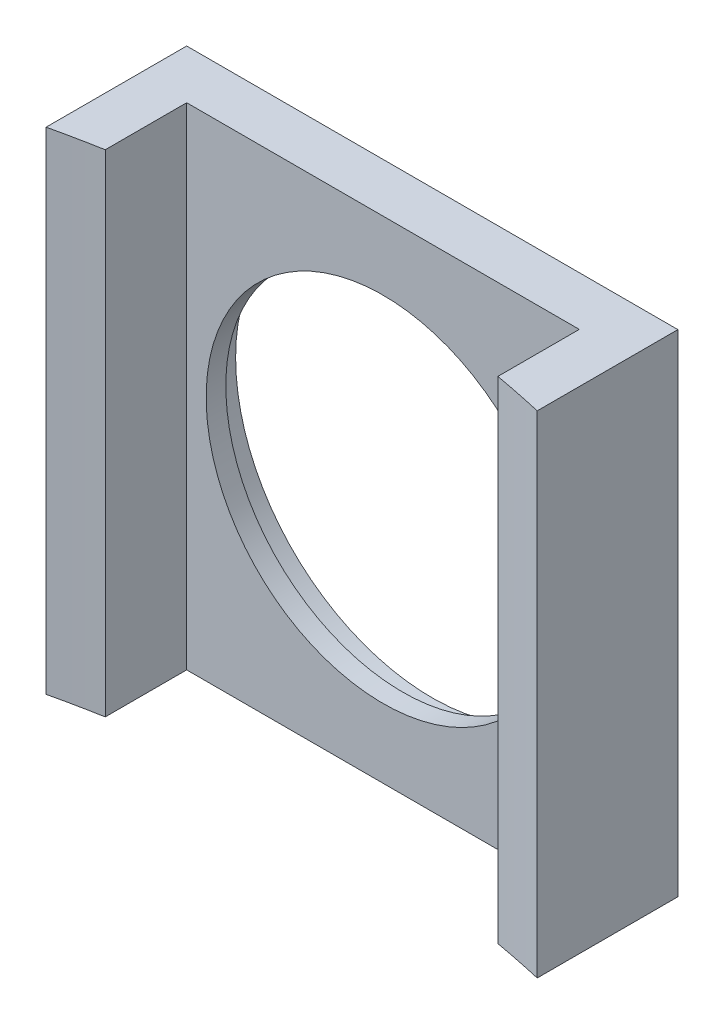
ISO-10303-21;
HEADER;
FILE_DESCRIPTION(('STEP AP214'),'2;1');
FILE_NAME('part.step','',(''),(''),'','','');
FILE_SCHEMA(('AUTOMOTIVE_DESIGN { 1 0 10303 214 1 1 1 1 }'));
ENDSEC;
DATA;
#1=APPLICATION_CONTEXT('core data for automotive mechanical design processes');
#2=APPLICATION_PROTOCOL_DEFINITION('international standard','automotive_design',2000,#1);
#3=PRODUCT_CONTEXT('',#1,'mechanical');
#4=PRODUCT('Part','Part','',(#3));
#5=PRODUCT_RELATED_PRODUCT_CATEGORY('part','',(#4));
#6=PRODUCT_DEFINITION_FORMATION('','',#4);
#7=PRODUCT_DEFINITION_CONTEXT('part definition',#1,'design');
#8=PRODUCT_DEFINITION('design','',#6,#7);
#9=PRODUCT_DEFINITION_SHAPE('','',#8);
#10=(LENGTH_UNIT() NAMED_UNIT(*) SI_UNIT(.MILLI.,.METRE.));
#11=(NAMED_UNIT(*) PLANE_ANGLE_UNIT() SI_UNIT($,.RADIAN.));
#12=(NAMED_UNIT(*) SI_UNIT($,.STERADIAN.) SOLID_ANGLE_UNIT());
#13=UNCERTAINTY_MEASURE_WITH_UNIT(LENGTH_MEASURE(1.E-05),#10,'distance_accuracy_value','');
#14=(GEOMETRIC_REPRESENTATION_CONTEXT(3) GLOBAL_UNCERTAINTY_ASSIGNED_CONTEXT((#13)) GLOBAL_UNIT_ASSIGNED_CONTEXT((#10,
#11,#12)) REPRESENTATION_CONTEXT('',''));
#15=CARTESIAN_POINT('',(0.,0.,0.));
#16=DIRECTION('',(0.,0.,1.));
#17=DIRECTION('',(1.,0.,0.));
#18=AXIS2_PLACEMENT_3D('',#15,#16,#17);
#19=CARTESIAN_POINT('',(-12.3195988214984,4.52949605606905,-1.2E-05));
#20=DIRECTION('',(0.,0.,1.));
#21=DIRECTION('',(1.,0.,0.));
#22=AXIS2_PLACEMENT_3D('',#19,#20,#21);
#23=CYLINDRICAL_SURFACE('',#22,18.);
#24=CARTESIAN_POINT('',(-12.3195988214984,4.52949605606905,5.));
#25=DIRECTION('',(0.,0.,1.));
#26=DIRECTION('',(1.,0.,0.));
#27=AXIS2_PLACEMENT_3D('',#24,#25,#26);
#28=CIRCLE('',#27,18.);
#29=CARTESIAN_POINT('',(5.68040117850157,4.52949605606905,5.));
#30=VERTEX_POINT('',#29);
#31=EDGE_CURVE('E128',#30,#30,#28,.T.);
#32=CARTESIAN_POINT('',(-12.3195988214984,4.52949605606905,3.));
#33=DIRECTION('',(0.,0.,-1.));
#34=DIRECTION('',(-1.,0.,0.));
#35=AXIS2_PLACEMENT_3D('',#32,#33,#34);
#36=CIRCLE('',#35,18.);
#37=CARTESIAN_POINT('',(5.68040117850157,4.52949605606905,3.));
#38=VERTEX_POINT('',#37);
#39=EDGE_CURVE('E126',#38,#38,#36,.F.);
#40=CARTESIAN_POINT('',(5.68040117850157,4.52949605606905,5.));
#41=CARTESIAN_POINT('',(5.68040117850157,4.52949605606905,4.97916666666667));
#42=CARTESIAN_POINT('',(5.68040117850157,4.52949605606905,4.95833333333333));
#43=CARTESIAN_POINT('',(5.68040117850157,4.52949605606905,4.91666666666667));
#44=CARTESIAN_POINT('',(5.68040117850157,4.52949605606905,4.89583333333333));
#45=CARTESIAN_POINT('',(5.68040117850157,4.52949605606905,4.85416666666667));
#46=CARTESIAN_POINT('',(5.68040117850157,4.52949605606905,4.83333333333333));
#47=CARTESIAN_POINT('',(5.68040117850157,4.52949605606905,4.79166666666667));
#48=CARTESIAN_POINT('',(5.68040117850157,4.52949605606905,4.77083333333333));
#49=CARTESIAN_POINT('',(5.68040117850157,4.52949605606905,4.72916666666667));
#50=CARTESIAN_POINT('',(5.68040117850157,4.52949605606905,4.70833333333333));
#51=CARTESIAN_POINT('',(5.68040117850157,4.52949605606905,4.66666666666667));
#52=CARTESIAN_POINT('',(5.68040117850157,4.52949605606905,4.64583333333333));
#53=CARTESIAN_POINT('',(5.68040117850157,4.52949605606905,4.60416666666667));
#54=CARTESIAN_POINT('',(5.68040117850157,4.52949605606905,4.58333333333333));
#55=CARTESIAN_POINT('',(5.68040117850157,4.52949605606905,4.54166666666667));
#56=CARTESIAN_POINT('',(5.68040117850157,4.52949605606905,4.52083333333333));
#57=CARTESIAN_POINT('',(5.68040117850157,4.52949605606905,4.47916666666667));
#58=CARTESIAN_POINT('',(5.68040117850157,4.52949605606905,4.45833333333333));
#59=CARTESIAN_POINT('',(5.68040117850157,4.52949605606905,4.41666666666667));
#60=CARTESIAN_POINT('',(5.68040117850157,4.52949605606905,4.39583333333333));
#61=CARTESIAN_POINT('',(5.68040117850157,4.52949605606905,4.35416666666667));
#62=CARTESIAN_POINT('',(5.68040117850157,4.52949605606905,4.33333333333333));
#63=CARTESIAN_POINT('',(5.68040117850157,4.52949605606905,4.29166666666667));
#64=CARTESIAN_POINT('',(5.68040117850157,4.52949605606905,4.27083333333333));
#65=CARTESIAN_POINT('',(5.68040117850157,4.52949605606905,4.22916666666667));
#66=CARTESIAN_POINT('',(5.68040117850157,4.52949605606905,4.20833333333333));
#67=CARTESIAN_POINT('',(5.68040117850157,4.52949605606905,4.16666666666667));
#68=CARTESIAN_POINT('',(5.68040117850157,4.52949605606905,4.14583333333333));
#69=CARTESIAN_POINT('',(5.68040117850157,4.52949605606905,4.10416666666667));
#70=CARTESIAN_POINT('',(5.68040117850157,4.52949605606905,4.08333333333333));
#71=CARTESIAN_POINT('',(5.68040117850157,4.52949605606905,4.04166666666667));
#72=CARTESIAN_POINT('',(5.68040117850157,4.52949605606905,4.02083333333333));
#73=CARTESIAN_POINT('',(5.68040117850157,4.52949605606905,3.97916666666667));
#74=CARTESIAN_POINT('',(5.68040117850157,4.52949605606905,3.95833333333333));
#75=CARTESIAN_POINT('',(5.68040117850157,4.52949605606905,3.91666666666667));
#76=CARTESIAN_POINT('',(5.68040117850157,4.52949605606905,3.89583333333333));
#77=CARTESIAN_POINT('',(5.68040117850157,4.52949605606905,3.85416666666667));
#78=CARTESIAN_POINT('',(5.68040117850157,4.52949605606905,3.83333333333333));
#79=CARTESIAN_POINT('',(5.68040117850157,4.52949605606905,3.79166666666667));
#80=CARTESIAN_POINT('',(5.68040117850157,4.52949605606905,3.77083333333333));
#81=CARTESIAN_POINT('',(5.68040117850157,4.52949605606905,3.72916666666667));
#82=CARTESIAN_POINT('',(5.68040117850157,4.52949605606905,3.70833333333333));
#83=CARTESIAN_POINT('',(5.68040117850157,4.52949605606905,3.66666666666667));
#84=CARTESIAN_POINT('',(5.68040117850157,4.52949605606905,3.64583333333333));
#85=CARTESIAN_POINT('',(5.68040117850157,4.52949605606905,3.60416666666667));
#86=CARTESIAN_POINT('',(5.68040117850157,4.52949605606905,3.58333333333333));
#87=CARTESIAN_POINT('',(5.68040117850157,4.52949605606905,3.54166666666667));
#88=CARTESIAN_POINT('',(5.68040117850157,4.52949605606905,3.52083333333333));
#89=CARTESIAN_POINT('',(5.68040117850157,4.52949605606905,3.47916666666667));
#90=CARTESIAN_POINT('',(5.68040117850157,4.52949605606905,3.45833333333333));
#91=CARTESIAN_POINT('',(5.68040117850157,4.52949605606905,3.41666666666667));
#92=CARTESIAN_POINT('',(5.68040117850157,4.52949605606905,3.39583333333333));
#93=CARTESIAN_POINT('',(5.68040117850157,4.52949605606905,3.35416666666667));
#94=CARTESIAN_POINT('',(5.68040117850157,4.52949605606905,3.33333333333333));
#95=CARTESIAN_POINT('',(5.68040117850157,4.52949605606905,3.29166666666667));
#96=CARTESIAN_POINT('',(5.68040117850157,4.52949605606905,3.27083333333333));
#97=CARTESIAN_POINT('',(5.68040117850157,4.52949605606905,3.22916666666667));
#98=CARTESIAN_POINT('',(5.68040117850157,4.52949605606905,3.20833333333333));
#99=CARTESIAN_POINT('',(5.68040117850157,4.52949605606905,3.16666666666667));
#100=CARTESIAN_POINT('',(5.68040117850157,4.52949605606905,3.14583333333333));
#101=CARTESIAN_POINT('',(5.68040117850157,4.52949605606905,3.10416666666667));
#102=CARTESIAN_POINT('',(5.68040117850157,4.52949605606905,3.08333333333333));
#103=CARTESIAN_POINT('',(5.68040117850157,4.52949605606905,3.04166666666667));
#104=CARTESIAN_POINT('',(5.68040117850157,4.52949605606905,3.02083333333333));
#105=CARTESIAN_POINT('',(5.68040117850157,4.52949605606905,3.));
#106=B_SPLINE_CURVE_WITH_KNOTS('',3,(#40,#41,#42,#43,#44,#45,#46,#47,#48,#49,#50,#51,#52,#53,
#54,#55,#56,#57,#58,#59,#60,#61,#62,#63,#64,#65,#66,#67,#68,#69,#70,#71,#72,#73,#74,#75,#76,#77,
#78,#79,#80,#81,#82,#83,#84,#85,#86,#87,#88,#89,#90,#91,#92,#93,#94,#95,#96,#97,#98,#99,#100,
#101,#102,#103,#104,#105),.UNSPECIFIED.,.F.,.F.,(4,2,2,2,2,2,2,2,2,2,2,2,2,2,2,2,2,2,2,2,2,2,2,
2,2,2,2,2,2,2,2,2,4),(0.,0.0625000000000001,0.125,0.1875,0.25,0.3125,0.374999999999999,0.4375,
0.5,0.5625,0.625,0.6875,0.75,0.8125,0.875,0.9375,0.999999999999999,1.0625,1.125,1.1875,1.25,
1.3125,1.375,1.4375,1.5,1.5625,1.625,1.6875,1.75,1.8125,1.875,1.9375,2.),.UNSPECIFIED.);
#107=EDGE_CURVE('BSEAM37',#30,#38,#106,.T.);
#108=ORIENTED_EDGE('',*,*,#31,.T.);
#109=ORIENTED_EDGE('',*,*,#39,.F.);
#110=ORIENTED_EDGE('',*,*,#107,.T.);
#111=ORIENTED_EDGE('',*,*,#107,.F.);
#112=EDGE_LOOP('',(#108,#110,#109,#111));
#113=FACE_BOUND('',#112,.T.);
#114=ADVANCED_FACE('F37',(#113),#23,.F.);
#115=CARTESIAN_POINT('',(0.,0.,5.));
#116=DIRECTION('',(0.,0.,1.));
#117=DIRECTION('',(1.,0.,0.));
#118=AXIS2_PLACEMENT_3D('',#115,#116,#117);
#119=PLANE('',#118);
#120=ORIENTED_EDGE('',*,*,#31,.F.);
#121=EDGE_LOOP('',(#120));
#122=FACE_BOUND('',#121,.T.);
#123=DIRECTION('',(1.,0.,0.));
#124=VECTOR('',#123,1.);
#125=CARTESIAN_POINT('',(-37.3015873015873,-20.5026455026455,5.));
#126=LINE('',#125,#124);
#127=CARTESIAN_POINT('',(-32.3015873015873,-20.5026455026455,5.));
#128=VERTEX_POINT('',#127);
#129=CARTESIAN_POINT('',(7.66238965859044,-20.5026455026455,5.));
#130=VERTEX_POINT('',#129);
#131=EDGE_CURVE('E158',#128,#130,#126,.T.);
#132=ORIENTED_EDGE('',*,*,#131,.T.);
#133=DIRECTION('',(0.,-1.,0.));
#134=VECTOR('',#133,1.);
#135=CARTESIAN_POINT('',(7.66238965859044,29.4973544973545,5.));
#136=LINE('',#135,#134);
#137=CARTESIAN_POINT('',(7.66238965859044,29.4973544973545,5.));
#138=VERTEX_POINT('',#137);
#139=EDGE_CURVE('E145',#138,#130,#136,.T.);
#140=ORIENTED_EDGE('',*,*,#139,.F.);
#141=DIRECTION('',(-1.,0.,0.));
#142=VECTOR('',#141,1.);
#143=CARTESIAN_POINT('',(-37.3015873015873,29.4973544973545,5.));
#144=LINE('',#143,#142);
#145=CARTESIAN_POINT('',(-32.3015873015873,29.4973544973545,5.));
#146=VERTEX_POINT('',#145);
#147=EDGE_CURVE('E155',#138,#146,#144,.T.);
#148=ORIENTED_EDGE('',*,*,#147,.T.);
#149=DIRECTION('',(0.,1.,0.));
#150=VECTOR('',#149,1.);
#151=CARTESIAN_POINT('',(-32.3015873015873,29.4973544973545,5.));
#152=LINE('',#151,#150);
#153=EDGE_CURVE('E148',#128,#146,#152,.T.);
#154=ORIENTED_EDGE('',*,*,#153,.F.);
#155=EDGE_LOOP('',(#132,#140,#148,#154));
#156=FACE_BOUND('',#155,.T.);
#157=ADVANCED_FACE('F191',(#122,#156),#119,.T.);
#158=CARTESIAN_POINT('',(12.6984126984127,29.4973544973545,5.));
#159=DIRECTION('',(-1.,0.,0.));
#160=DIRECTION('',(0.,-1.,0.));
#161=AXIS2_PLACEMENT_3D('',#158,#159,#160);
#162=PLANE('',#161);
#163=DIRECTION('',(0.,0.,-1.));
#164=VECTOR('',#163,1.);
#165=CARTESIAN_POINT('',(12.6984126984127,29.4973544973545,5.));
#166=LINE('',#165,#164);
#167=CARTESIAN_POINT('',(12.6984126984127,29.4973544973545,14.3170519196825));
#168=VERTEX_POINT('',#167);
#169=CARTESIAN_POINT('',(12.6984126984127,29.4973544973545,0.));
#170=VERTEX_POINT('',#169);
#171=EDGE_CURVE('E45',#168,#170,#166,.T.);
#172=ORIENTED_EDGE('',*,*,#171,.F.);
#173=DIRECTION('',(0.,1.,0.));
#174=VECTOR('',#173,1.);
#175=CARTESIAN_POINT('',(12.6984126984127,-20.5026455026455,14.3170519196825));
#176=LINE('',#175,#174);
#177=CARTESIAN_POINT('',(12.6984126984127,-20.5026455026455,14.3170519196825));
#178=VERTEX_POINT('',#177);
#179=EDGE_CURVE('E99',#168,#178,#176,.F.);
#180=ORIENTED_EDGE('',*,*,#179,.T.);
#181=DIRECTION('',(0.,0.,-1.));
#182=VECTOR('',#181,1.);
#183=CARTESIAN_POINT('',(12.6984126984127,-20.5026455026455,5.));
#184=LINE('',#183,#182);
#185=CARTESIAN_POINT('',(12.6984126984127,-20.5026455026455,0.));
#186=VERTEX_POINT('',#185);
#187=EDGE_CURVE('E162',#178,#186,#184,.T.);
#188=ORIENTED_EDGE('',*,*,#187,.T.);
#189=DIRECTION('',(0.,1.,0.));
#190=VECTOR('',#189,1.);
#191=CARTESIAN_POINT('',(12.6984126984127,29.4973544973545,0.));
#192=LINE('',#191,#190);
#193=EDGE_CURVE('E120',#186,#170,#192,.T.);
#194=ORIENTED_EDGE('',*,*,#193,.T.);
#195=EDGE_LOOP('',(#172,#180,#188,#194));
#196=FACE_BOUND('',#195,.T.);
#197=ADVANCED_FACE('F39',(#196),#162,.F.);
#198=CARTESIAN_POINT('',(-37.3015873015873,29.4973544973545,5.));
#199=DIRECTION('',(0.,-1.,0.));
#200=DIRECTION('',(0.,0.,-1.));
#201=AXIS2_PLACEMENT_3D('',#198,#199,#200);
#202=PLANE('',#201);
#203=DIRECTION('',(0.,0.,-1.));
#204=VECTOR('',#203,1.);
#205=CARTESIAN_POINT('',(7.66238965859044,29.4973544973545,16.));
#206=LINE('',#205,#204);
#207=CARTESIAN_POINT('',(7.66238965859044,29.4973544973545,13.2887985053832));
#208=VERTEX_POINT('',#207);
#209=EDGE_CURVE('E115',#208,#138,#206,.T.);
#210=ORIENTED_EDGE('',*,*,#209,.F.);
#211=CARTESIAN_POINT('',(-12.3195988214984,29.4973544973545,124.));
#212=DIRECTION('',(0.,1.,0.));
#213=DIRECTION('',(0.,0.,1.));
#214=AXIS2_PLACEMENT_3D('',#211,#212,#213);
#215=CIRCLE('',#214,112.5);
#216=EDGE_CURVE('E60',#168,#208,#215,.T.);
#217=ORIENTED_EDGE('',*,*,#216,.F.);
#218=ORIENTED_EDGE('',*,*,#171,.T.);
#219=DIRECTION('',(-1.,0.,0.));
#220=VECTOR('',#219,1.);
#221=CARTESIAN_POINT('',(-37.3015873015873,29.4973544973545,0.));
#222=LINE('',#221,#220);
#223=CARTESIAN_POINT('',(-37.3015873015873,29.4973544973545,0.));
#224=VERTEX_POINT('',#223);
#225=EDGE_CURVE('E164',#170,#224,#222,.T.);
#226=ORIENTED_EDGE('',*,*,#225,.T.);
#227=DIRECTION('',(0.,0.,-1.));
#228=VECTOR('',#227,1.);
#229=CARTESIAN_POINT('',(-37.3015873015873,29.4973544973545,5.));
#230=LINE('',#229,#228);
#231=CARTESIAN_POINT('',(-37.3015873015873,29.4973544973545,14.3088415067981));
#232=VERTEX_POINT('',#231);
#233=EDGE_CURVE('E121',#232,#224,#230,.T.);
#234=ORIENTED_EDGE('',*,*,#233,.F.);
#235=CARTESIAN_POINT('',(-32.3015873015873,29.4973544973545,13.2887985053832));
#236=VERTEX_POINT('',#235);
#237=EDGE_CURVE('E116',#236,#232,#215,.T.);
#238=ORIENTED_EDGE('',*,*,#237,.F.);
#239=DIRECTION('',(0.,0.,-1.));
#240=VECTOR('',#239,1.);
#241=CARTESIAN_POINT('',(-32.3015873015873,29.4973544973545,16.));
#242=LINE('',#241,#240);
#243=EDGE_CURVE('E151',#236,#146,#242,.T.);
#244=ORIENTED_EDGE('',*,*,#243,.T.);
#245=ORIENTED_EDGE('',*,*,#147,.F.);
#246=EDGE_LOOP('',(#210,#217,#218,#226,#234,#238,#244,#245));
#247=FACE_BOUND('',#246,.T.);
#248=ADVANCED_FACE('F111',(#247),#202,.F.);
#249=CARTESIAN_POINT('',(-37.3015873015873,29.4973544973545,5.));
#250=DIRECTION('',(1.,0.,0.));
#251=DIRECTION('',(0.,1.,0.));
#252=AXIS2_PLACEMENT_3D('',#249,#250,#251);
#253=PLANE('',#252);
#254=DIRECTION('',(0.,0.,-1.));
#255=VECTOR('',#254,1.);
#256=CARTESIAN_POINT('',(-37.3015873015873,-20.5026455026455,5.));
#257=LINE('',#256,#255);
#258=CARTESIAN_POINT('',(-37.3015873015873,-20.5026455026455,14.3088415067981));
#259=VERTEX_POINT('',#258);
#260=CARTESIAN_POINT('',(-37.3015873015873,-20.5026455026455,0.));
#261=VERTEX_POINT('',#260);
#262=EDGE_CURVE('E123',#259,#261,#257,.T.);
#263=ORIENTED_EDGE('',*,*,#262,.F.);
#264=DIRECTION('',(0.,1.,0.));
#265=VECTOR('',#264,1.);
#266=CARTESIAN_POINT('',(-37.3015873015873,-20.5026455026455,14.3088415067981));
#267=LINE('',#266,#265);
#268=EDGE_CURVE('E107',#259,#232,#267,.T.);
#269=ORIENTED_EDGE('',*,*,#268,.T.);
#270=ORIENTED_EDGE('',*,*,#233,.T.);
#271=DIRECTION('',(0.,-1.,0.));
#272=VECTOR('',#271,1.);
#273=CARTESIAN_POINT('',(-37.3015873015873,29.4973544973545,0.));
#274=LINE('',#273,#272);
#275=EDGE_CURVE('E166',#224,#261,#274,.T.);
#276=ORIENTED_EDGE('',*,*,#275,.T.);
#277=EDGE_LOOP('',(#263,#269,#270,#276));
#278=FACE_BOUND('',#277,.T.);
#279=ADVANCED_FACE('F179',(#278),#253,.F.);
#280=CARTESIAN_POINT('',(-37.3015873015873,-20.5026455026455,5.));
#281=DIRECTION('',(0.,1.,0.));
#282=DIRECTION('',(0.,0.,1.));
#283=AXIS2_PLACEMENT_3D('',#280,#281,#282);
#284=PLANE('',#283);
#285=ORIENTED_EDGE('',*,*,#187,.F.);
#286=CARTESIAN_POINT('',(-12.3195988214984,-20.5026455026455,124.));
#287=DIRECTION('',(0.,1.,0.));
#288=DIRECTION('',(0.,0.,1.));
#289=AXIS2_PLACEMENT_3D('',#286,#287,#288);
#290=CIRCLE('',#289,112.5);
#291=CARTESIAN_POINT('',(7.66238965859044,-20.5026455026455,13.2887985053832));
#292=VERTEX_POINT('',#291);
#293=EDGE_CURVE('E102',#178,#292,#290,.T.);
#294=ORIENTED_EDGE('',*,*,#293,.T.);
#295=DIRECTION('',(0.,0.,-1.));
#296=VECTOR('',#295,1.);
#297=CARTESIAN_POINT('',(7.66238965859044,-20.5026455026455,16.));
#298=LINE('',#297,#296);
#299=EDGE_CURVE('E143',#292,#130,#298,.T.);
#300=ORIENTED_EDGE('',*,*,#299,.T.);
#301=ORIENTED_EDGE('',*,*,#131,.F.);
#302=DIRECTION('',(0.,0.,-1.));
#303=VECTOR('',#302,1.);
#304=CARTESIAN_POINT('',(-32.3015873015873,-20.5026455026455,16.));
#305=LINE('',#304,#303);
#306=CARTESIAN_POINT('',(-32.3015873015873,-20.5026455026455,13.2887985053832));
#307=VERTEX_POINT('',#306);
#308=EDGE_CURVE('E153',#307,#128,#305,.T.);
#309=ORIENTED_EDGE('',*,*,#308,.F.);
#310=EDGE_CURVE('E52',#307,#259,#290,.T.);
#311=ORIENTED_EDGE('',*,*,#310,.T.);
#312=ORIENTED_EDGE('',*,*,#262,.T.);
#313=DIRECTION('',(1.,0.,0.));
#314=VECTOR('',#313,1.);
#315=CARTESIAN_POINT('',(-37.3015873015873,-20.5026455026455,0.));
#316=LINE('',#315,#314);
#317=EDGE_CURVE('E159',#261,#186,#316,.T.);
#318=ORIENTED_EDGE('',*,*,#317,.T.);
#319=EDGE_LOOP('',(#285,#294,#300,#301,#309,#311,#312,#318));
#320=FACE_BOUND('',#319,.T.);
#321=ADVANCED_FACE('F173',(#320),#284,.F.);
#322=CARTESIAN_POINT('',(0.,0.,0.));
#323=DIRECTION('',(0.,0.,1.));
#324=DIRECTION('',(1.,0.,0.));
#325=AXIS2_PLACEMENT_3D('',#322,#323,#324);
#326=PLANE('',#325);
#327=CARTESIAN_POINT('',(-12.3195988214984,4.52949605606905,0.));
#328=DIRECTION('',(0.,0.,-1.));
#329=DIRECTION('',(-1.,0.,0.));
#330=AXIS2_PLACEMENT_3D('',#327,#328,#329);
#331=CIRCLE('',#330,20.);
#332=CARTESIAN_POINT('',(-32.3195988214984,4.52949605606905,0.));
#333=VERTEX_POINT('',#332);
#334=EDGE_CURVE('E106',#333,#333,#331,.T.);
#335=ORIENTED_EDGE('',*,*,#334,.F.);
#336=EDGE_LOOP('',(#335));
#337=FACE_BOUND('',#336,.T.);
#338=ORIENTED_EDGE('',*,*,#193,.F.);
#339=ORIENTED_EDGE('',*,*,#317,.F.);
#340=ORIENTED_EDGE('',*,*,#275,.F.);
#341=ORIENTED_EDGE('',*,*,#225,.F.);
#342=EDGE_LOOP('',(#338,#339,#340,#341));
#343=FACE_BOUND('',#342,.T.);
#344=ADVANCED_FACE('F182',(#337,#343),#326,.F.);
#345=CARTESIAN_POINT('',(-32.3015873015873,29.4973544973545,16.));
#346=DIRECTION('',(-1.,0.,0.));
#347=DIRECTION('',(0.,-1.,0.));
#348=AXIS2_PLACEMENT_3D('',#345,#346,#347);
#349=PLANE('',#348);
#350=ORIENTED_EDGE('',*,*,#243,.F.);
#351=DIRECTION('',(0.,1.,0.));
#352=VECTOR('',#351,1.);
#353=CARTESIAN_POINT('',(-32.3015873015873,-20.5026455026455,13.2887985053832));
#354=LINE('',#353,#352);
#355=EDGE_CURVE('E187',#236,#307,#354,.F.);
#356=ORIENTED_EDGE('',*,*,#355,.T.);
#357=ORIENTED_EDGE('',*,*,#308,.T.);
#358=ORIENTED_EDGE('',*,*,#153,.T.);
#359=EDGE_LOOP('',(#350,#356,#357,#358));
#360=FACE_BOUND('',#359,.T.);
#361=ADVANCED_FACE('F186',(#360),#349,.F.);
#362=CARTESIAN_POINT('',(7.66238965859044,29.4973544973545,16.));
#363=DIRECTION('',(1.,0.,0.));
#364=DIRECTION('',(0.,0.,-1.));
#365=AXIS2_PLACEMENT_3D('',#362,#363,#364);
#366=PLANE('',#365);
#367=ORIENTED_EDGE('',*,*,#299,.F.);
#368=DIRECTION('',(0.,1.,0.));
#369=VECTOR('',#368,1.);
#370=CARTESIAN_POINT('',(7.66238965859044,-20.5026455026455,13.2887985053832));
#371=LINE('',#370,#369);
#372=EDGE_CURVE('E11',#292,#208,#371,.T.);
#373=ORIENTED_EDGE('',*,*,#372,.T.);
#374=ORIENTED_EDGE('',*,*,#209,.T.);
#375=ORIENTED_EDGE('',*,*,#139,.T.);
#376=EDGE_LOOP('',(#367,#373,#374,#375));
#377=FACE_BOUND('',#376,.T.);
#378=ADVANCED_FACE('F195',(#377),#366,.F.);
#379=CARTESIAN_POINT('',(-12.3195988214984,4.52949605606905,3.));
#380=DIRECTION('',(0.,0.,-1.));
#381=DIRECTION('',(-1.,0.,0.));
#382=AXIS2_PLACEMENT_3D('',#379,#380,#381);
#383=PLANE('',#382);
#384=CARTESIAN_POINT('',(-12.3195988214984,4.52949605606905,3.));
#385=DIRECTION('',(0.,0.,-1.));
#386=DIRECTION('',(-1.,0.,0.));
#387=AXIS2_PLACEMENT_3D('',#384,#385,#386);
#388=CIRCLE('',#387,20.);
#389=CARTESIAN_POINT('',(-32.3195988214984,4.52949605606905,3.));
#390=VERTEX_POINT('',#389);
#391=EDGE_CURVE('E129',#390,#390,#388,.T.);
#392=ORIENTED_EDGE('',*,*,#391,.T.);
#393=EDGE_LOOP('',(#392));
#394=FACE_BOUND('',#393,.T.);
#395=ORIENTED_EDGE('',*,*,#39,.T.);
#396=EDGE_LOOP('',(#395));
#397=FACE_BOUND('',#396,.T.);
#398=ADVANCED_FACE('F197',(#394,#397),#383,.T.);
#399=CARTESIAN_POINT('',(-12.3195988214984,4.52949605606905,3.));
#400=DIRECTION('',(0.,0.,-1.));
#401=DIRECTION('',(-1.,0.,0.));
#402=AXIS2_PLACEMENT_3D('',#399,#400,#401);
#403=CYLINDRICAL_SURFACE('',#402,20.);
#404=ORIENTED_EDGE('',*,*,#391,.F.);
#405=EDGE_LOOP('',(#404));
#406=FACE_BOUND('',#405,.T.);
#407=ORIENTED_EDGE('',*,*,#334,.T.);
#408=EDGE_LOOP('',(#407));
#409=FACE_BOUND('',#408,.T.);
#410=ADVANCED_FACE('F203',(#406,#409),#403,.F.);
#411=CARTESIAN_POINT('',(-12.3195988214984,-20.5026455026455,124.));
#412=DIRECTION('',(0.,1.,0.));
#413=DIRECTION('',(0.,0.,1.));
#414=AXIS2_PLACEMENT_3D('',#411,#412,#413);
#415=CYLINDRICAL_SURFACE('',#414,112.5);
#416=ORIENTED_EDGE('',*,*,#216,.T.);
#417=ORIENTED_EDGE('',*,*,#372,.F.);
#418=ORIENTED_EDGE('',*,*,#293,.F.);
#419=ORIENTED_EDGE('',*,*,#179,.F.);
#420=EDGE_LOOP('',(#416,#417,#418,#419));
#421=FACE_BOUND('',#420,.T.);
#422=ADVANCED_FACE('F100',(#421),#415,.F.);
#423=ORIENTED_EDGE('',*,*,#310,.F.);
#424=ORIENTED_EDGE('',*,*,#355,.F.);
#425=ORIENTED_EDGE('',*,*,#237,.T.);
#426=ORIENTED_EDGE('',*,*,#268,.F.);
#427=EDGE_LOOP('',(#423,#424,#425,#426));
#428=FACE_BOUND('',#427,.T.);
#429=ADVANCED_FACE('F220',(#428),#415,.F.);
#430=CLOSED_SHELL('',(#114,#157,#197,#248,#279,#321,#344,#361,#378,#398,#410,#422,#429));
#431=MANIFOLD_SOLID_BREP('B2',#430);
#432=ADVANCED_BREP_SHAPE_REPRESENTATION('',(#18,#431),#14);
#433=SHAPE_DEFINITION_REPRESENTATION(#9,#432);
ENDSEC;
END-ISO-10303-21;
